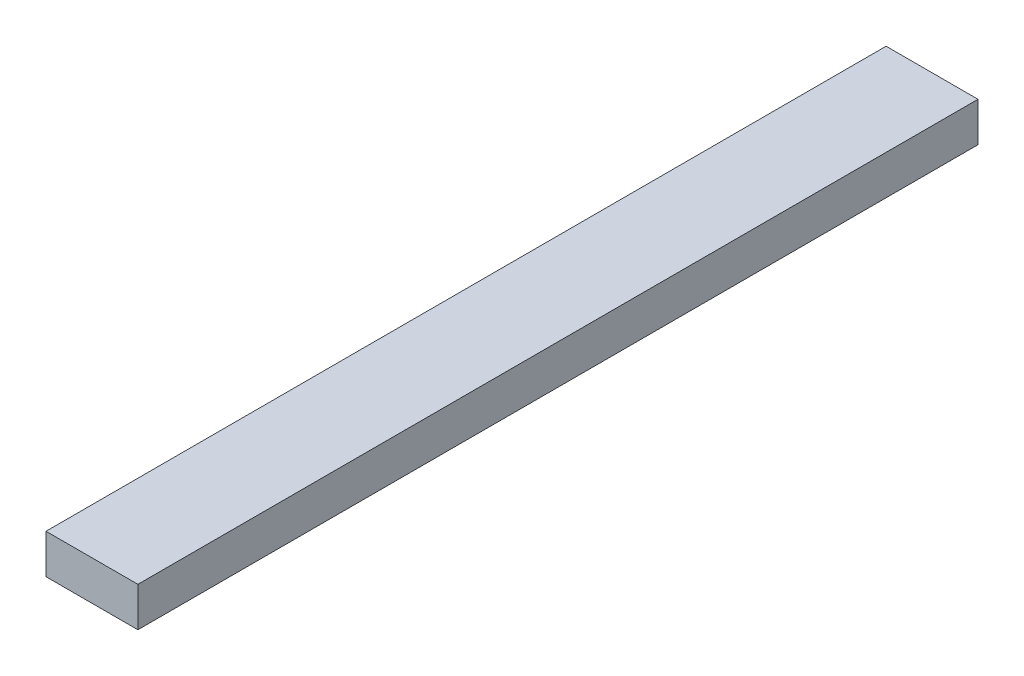
ISO-10303-21;
HEADER;
FILE_DESCRIPTION(('STEP AP214'),'2;1');
FILE_NAME('part.step','',(''),(''),'','','');
FILE_SCHEMA(('AUTOMOTIVE_DESIGN { 1 0 10303 214 1 1 1 1 }'));
ENDSEC;
DATA;
#1=APPLICATION_CONTEXT('core data for automotive mechanical design processes');
#2=APPLICATION_PROTOCOL_DEFINITION('international standard','automotive_design',2000,#1);
#3=PRODUCT_CONTEXT('',#1,'mechanical');
#4=PRODUCT('Part','Part','',(#3));
#5=PRODUCT_RELATED_PRODUCT_CATEGORY('part','',(#4));
#6=PRODUCT_DEFINITION_FORMATION('','',#4);
#7=PRODUCT_DEFINITION_CONTEXT('part definition',#1,'design');
#8=PRODUCT_DEFINITION('design','',#6,#7);
#9=PRODUCT_DEFINITION_SHAPE('','',#8);
#10=(LENGTH_UNIT() NAMED_UNIT(*) SI_UNIT(.MILLI.,.METRE.));
#11=(NAMED_UNIT(*) PLANE_ANGLE_UNIT() SI_UNIT($,.RADIAN.));
#12=(NAMED_UNIT(*) SI_UNIT($,.STERADIAN.) SOLID_ANGLE_UNIT());
#13=UNCERTAINTY_MEASURE_WITH_UNIT(LENGTH_MEASURE(1.E-05),#10,'distance_accuracy_value','');
#14=(GEOMETRIC_REPRESENTATION_CONTEXT(3) GLOBAL_UNCERTAINTY_ASSIGNED_CONTEXT((#13)) GLOBAL_UNIT_ASSIGNED_CONTEXT((#10,
#11,#12)) REPRESENTATION_CONTEXT('',''));
#15=CARTESIAN_POINT('',(0.,0.,0.));
#16=DIRECTION('',(0.,0.,1.));
#17=DIRECTION('',(1.,0.,0.));
#18=AXIS2_PLACEMENT_3D('',#15,#16,#17);
#19=CARTESIAN_POINT('',(0.,0.,812.8));
#20=DIRECTION('',(1.,0.,0.));
#21=DIRECTION('',(0.,0.,-1.));
#22=AXIS2_PLACEMENT_3D('',#19,#20,#21);
#23=PLANE('',#22);
#24=DIRECTION('',(0.,-1.,0.));
#25=VECTOR('',#24,1.);
#26=CARTESIAN_POINT('',(0.,0.,0.));
#27=LINE('',#26,#25);
#28=CARTESIAN_POINT('',(0.,38.1,0.));
#29=VERTEX_POINT('',#28);
#30=CARTESIAN_POINT('',(0.,0.,0.));
#31=VERTEX_POINT('',#30);
#32=EDGE_CURVE('E97',#29,#31,#27,.T.);
#33=ORIENTED_EDGE('',*,*,#32,.T.);
#34=DIRECTION('',(0.,0.,-1.));
#35=VECTOR('',#34,1.);
#36=CARTESIAN_POINT('',(0.,0.,812.8));
#37=LINE('',#36,#35);
#38=CARTESIAN_POINT('',(0.,0.,812.8));
#39=VERTEX_POINT('',#38);
#40=EDGE_CURVE('E11',#39,#31,#37,.T.);
#41=ORIENTED_EDGE('',*,*,#40,.F.);
#42=DIRECTION('',(0.,-1.,0.));
#43=VECTOR('',#42,1.);
#44=CARTESIAN_POINT('',(0.,0.,812.8));
#45=LINE('',#44,#43);
#46=CARTESIAN_POINT('',(0.,38.1,812.8));
#47=VERTEX_POINT('',#46);
#48=EDGE_CURVE('E85',#47,#39,#45,.T.);
#49=ORIENTED_EDGE('',*,*,#48,.F.);
#50=DIRECTION('',(0.,0.,-1.));
#51=VECTOR('',#50,1.);
#52=CARTESIAN_POINT('',(0.,38.1,812.8));
#53=LINE('',#52,#51);
#54=EDGE_CURVE('E93',#47,#29,#53,.T.);
#55=ORIENTED_EDGE('',*,*,#54,.T.);
#56=EDGE_LOOP('',(#33,#41,#49,#55));
#57=FACE_BOUND('',#56,.T.);
#58=ADVANCED_FACE('F34',(#57),#23,.F.);
#59=CARTESIAN_POINT('',(0.,0.,812.8));
#60=DIRECTION('',(0.,1.,0.));
#61=DIRECTION('',(0.,0.,1.));
#62=AXIS2_PLACEMENT_3D('',#59,#60,#61);
#63=PLANE('',#62);
#64=DIRECTION('',(1.,0.,0.));
#65=VECTOR('',#64,1.);
#66=CARTESIAN_POINT('',(0.,0.,0.));
#67=LINE('',#66,#65);
#68=CARTESIAN_POINT('',(88.9,0.,0.));
#69=VERTEX_POINT('',#68);
#70=EDGE_CURVE('E89',#31,#69,#67,.T.);
#71=ORIENTED_EDGE('',*,*,#70,.T.);
#72=DIRECTION('',(0.,0.,-1.));
#73=VECTOR('',#72,1.);
#74=CARTESIAN_POINT('',(88.9,0.,812.8));
#75=LINE('',#74,#73);
#76=CARTESIAN_POINT('',(88.9,0.,812.8));
#77=VERTEX_POINT('',#76);
#78=EDGE_CURVE('E42',#77,#69,#75,.T.);
#79=ORIENTED_EDGE('',*,*,#78,.F.);
#80=DIRECTION('',(1.,0.,0.));
#81=VECTOR('',#80,1.);
#82=CARTESIAN_POINT('',(0.,0.,812.8));
#83=LINE('',#82,#81);
#84=EDGE_CURVE('E80',#39,#77,#83,.T.);
#85=ORIENTED_EDGE('',*,*,#84,.F.);
#86=ORIENTED_EDGE('',*,*,#40,.T.);
#87=EDGE_LOOP('',(#71,#79,#85,#86));
#88=FACE_BOUND('',#87,.T.);
#89=ADVANCED_FACE('F88',(#88),#63,.F.);
#90=CARTESIAN_POINT('',(88.9,0.,812.8));
#91=DIRECTION('',(-1.,0.,0.));
#92=DIRECTION('',(0.,0.,1.));
#93=AXIS2_PLACEMENT_3D('',#90,#91,#92);
#94=PLANE('',#93);
#95=DIRECTION('',(0.,1.,0.));
#96=VECTOR('',#95,1.);
#97=CARTESIAN_POINT('',(88.9,0.,0.));
#98=LINE('',#97,#96);
#99=CARTESIAN_POINT('',(88.9,38.1,0.));
#100=VERTEX_POINT('',#99);
#101=EDGE_CURVE('E67',#69,#100,#98,.T.);
#102=ORIENTED_EDGE('',*,*,#101,.T.);
#103=DIRECTION('',(0.,0.,-1.));
#104=VECTOR('',#103,1.);
#105=CARTESIAN_POINT('',(88.9,38.1,812.8));
#106=LINE('',#105,#104);
#107=CARTESIAN_POINT('',(88.9,38.1,812.8));
#108=VERTEX_POINT('',#107);
#109=EDGE_CURVE('E90',#108,#100,#106,.T.);
#110=ORIENTED_EDGE('',*,*,#109,.F.);
#111=DIRECTION('',(0.,1.,0.));
#112=VECTOR('',#111,1.);
#113=CARTESIAN_POINT('',(88.9,0.,812.8));
#114=LINE('',#113,#112);
#115=EDGE_CURVE('E83',#77,#108,#114,.T.);
#116=ORIENTED_EDGE('',*,*,#115,.F.);
#117=ORIENTED_EDGE('',*,*,#78,.T.);
#118=EDGE_LOOP('',(#102,#110,#116,#117));
#119=FACE_BOUND('',#118,.T.);
#120=ADVANCED_FACE('F91',(#119),#94,.F.);
#121=CARTESIAN_POINT('',(0.,38.1,812.8));
#122=DIRECTION('',(0.,-1.,0.));
#123=DIRECTION('',(0.,0.,-1.));
#124=AXIS2_PLACEMENT_3D('',#121,#122,#123);
#125=PLANE('',#124);
#126=DIRECTION('',(-1.,0.,0.));
#127=VECTOR('',#126,1.);
#128=CARTESIAN_POINT('',(0.,38.1,0.));
#129=LINE('',#128,#127);
#130=EDGE_CURVE('E73',#100,#29,#129,.T.);
#131=ORIENTED_EDGE('',*,*,#130,.T.);
#132=ORIENTED_EDGE('',*,*,#54,.F.);
#133=DIRECTION('',(-1.,0.,0.));
#134=VECTOR('',#133,1.);
#135=CARTESIAN_POINT('',(0.,38.1,812.8));
#136=LINE('',#135,#134);
#137=EDGE_CURVE('E50',#108,#47,#136,.T.);
#138=ORIENTED_EDGE('',*,*,#137,.F.);
#139=ORIENTED_EDGE('',*,*,#109,.T.);
#140=EDGE_LOOP('',(#131,#132,#138,#139));
#141=FACE_BOUND('',#140,.T.);
#142=ADVANCED_FACE('F104',(#141),#125,.F.);
#143=CARTESIAN_POINT('',(0.,0.,812.8));
#144=DIRECTION('',(0.,0.,-1.));
#145=DIRECTION('',(-1.,0.,0.));
#146=AXIS2_PLACEMENT_3D('',#143,#144,#145);
#147=PLANE('',#146);
#148=ORIENTED_EDGE('',*,*,#48,.T.);
#149=ORIENTED_EDGE('',*,*,#84,.T.);
#150=ORIENTED_EDGE('',*,*,#115,.T.);
#151=ORIENTED_EDGE('',*,*,#137,.T.);
#152=EDGE_LOOP('',(#148,#149,#150,#151));
#153=FACE_BOUND('',#152,.T.);
#154=ADVANCED_FACE('F81',(#153),#147,.F.);
#155=CARTESIAN_POINT('',(0.,0.,0.));
#156=DIRECTION('',(0.,0.,-1.));
#157=DIRECTION('',(-1.,0.,0.));
#158=AXIS2_PLACEMENT_3D('',#155,#156,#157);
#159=PLANE('',#158);
#160=ORIENTED_EDGE('',*,*,#32,.F.);
#161=ORIENTED_EDGE('',*,*,#130,.F.);
#162=ORIENTED_EDGE('',*,*,#101,.F.);
#163=ORIENTED_EDGE('',*,*,#70,.F.);
#164=EDGE_LOOP('',(#160,#161,#162,#163));
#165=FACE_BOUND('',#164,.T.);
#166=ADVANCED_FACE('F107',(#165),#159,.T.);
#167=CLOSED_SHELL('',(#58,#89,#120,#142,#154,#166));
#168=MANIFOLD_SOLID_BREP('B2',#167);
#169=ADVANCED_BREP_SHAPE_REPRESENTATION('',(#18,#168),#14);
#170=SHAPE_DEFINITION_REPRESENTATION(#9,#169);
ENDSEC;
END-ISO-10303-21;
